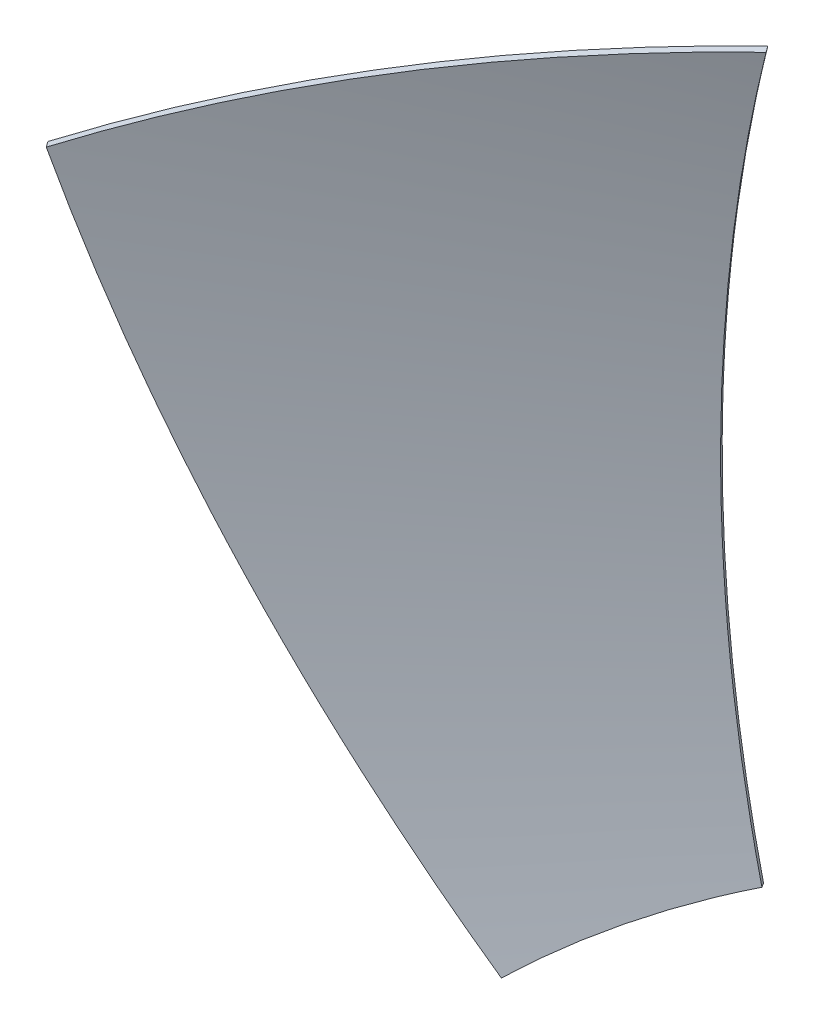
ISO-10303-21;
HEADER;
FILE_DESCRIPTION(('STEP AP214'),'2;1');
FILE_NAME('part.step','',(''),(''),'','','');
FILE_SCHEMA(('AUTOMOTIVE_DESIGN { 1 0 10303 214 1 1 1 1 }'));
ENDSEC;
DATA;
#1=APPLICATION_CONTEXT('core data for automotive mechanical design processes');
#2=APPLICATION_PROTOCOL_DEFINITION('international standard','automotive_design',2000,#1);
#3=PRODUCT_CONTEXT('',#1,'mechanical');
#4=PRODUCT('Part','Part','',(#3));
#5=PRODUCT_RELATED_PRODUCT_CATEGORY('part','',(#4));
#6=PRODUCT_DEFINITION_FORMATION('','',#4);
#7=PRODUCT_DEFINITION_CONTEXT('part definition',#1,'design');
#8=PRODUCT_DEFINITION('design','',#6,#7);
#9=PRODUCT_DEFINITION_SHAPE('','',#8);
#10=(LENGTH_UNIT() NAMED_UNIT(*) SI_UNIT(.MILLI.,.METRE.));
#11=(NAMED_UNIT(*) PLANE_ANGLE_UNIT() SI_UNIT($,.RADIAN.));
#12=(NAMED_UNIT(*) SI_UNIT($,.STERADIAN.) SOLID_ANGLE_UNIT());
#13=UNCERTAINTY_MEASURE_WITH_UNIT(LENGTH_MEASURE(1.E-05),#10,'distance_accuracy_value','');
#14=(GEOMETRIC_REPRESENTATION_CONTEXT(3) GLOBAL_UNCERTAINTY_ASSIGNED_CONTEXT((#13)) GLOBAL_UNIT_ASSIGNED_CONTEXT((#10,
#11,#12)) REPRESENTATION_CONTEXT('',''));
#15=CARTESIAN_POINT('',(0.,0.,0.));
#16=DIRECTION('',(0.,0.,1.));
#17=DIRECTION('',(1.,0.,0.));
#18=AXIS2_PLACEMENT_3D('',#15,#16,#17);
#19=CARTESIAN_POINT('',(165.867230023317,-110.043859723966,-2.70380006521002));
#20=DIRECTION('',(0.,0.,1.));
#21=DIRECTION('',(1.,0.,0.));
#22=AXIS2_PLACEMENT_3D('',#19,#20,#21);
#23=CONICAL_SURFACE('',#22,60.5897364806189,0.959931088596881);
#24=CARTESIAN_POINT('',(105.716633696539,-103.422289759919,-2.75685890943678));
#25=CARTESIAN_POINT('',(105.743501651271,-103.551387006296,-2.78545031312072));
#26=CARTESIAN_POINT('',(105.770834919118,-103.680379325531,-2.81408465061473));
#27=CARTESIAN_POINT('',(105.909830612346,-104.324848192517,-2.95747717970017));
#28=CARTESIAN_POINT('',(106.028451229861,-104.838701284113,-3.07286577250563));
#29=CARTESIAN_POINT('',(106.280340854169,-105.862523408114,-3.3048704575609));
#30=CARTESIAN_POINT('',(106.413609844876,-106.372492444783,-3.42148654846262));
#31=CARTESIAN_POINT('',(106.624366015325,-107.134198682592,-3.59725706665478));
#32=CARTESIAN_POINT('',(106.696423973306,-107.387550187204,-3.65598610471719));
#33=CARTESIAN_POINT('',(106.918018487235,-108.145983635365,-3.83260058189093));
#34=CARTESIAN_POINT('',(107.0729658705,-108.649406967771,-3.95090479887659));
#35=CARTESIAN_POINT('',(107.316082445498,-109.400834933894,-4.12913447064166));
#36=CARTESIAN_POINT('',(107.398900640504,-109.650683951422,-4.18867104560923));
#37=CARTESIAN_POINT('',(107.652708548266,-110.39838282532,-4.36767929954568));
#38=CARTESIAN_POINT('',(107.829040122655,-110.894347264222,-4.48754075801295));
#39=CARTESIAN_POINT('',(108.104106659498,-111.634122462909,-4.66806549431414));
#40=CARTESIAN_POINT('',(108.197553393411,-111.880009961774,-4.72836026083694));
#41=CARTESIAN_POINT('',(108.483197884536,-112.615577297198,-4.90963294286519));
#42=CARTESIAN_POINT('',(108.680686744574,-113.10312487349,-5.0309902786007));
#43=CARTESIAN_POINT('',(109.089547675613,-114.072121037847,-5.27461098125751));
#44=CARTESIAN_POINT('',(109.300919730649,-114.553569632925,-5.39687434713671));
#45=CARTESIAN_POINT('',(109.737288395776,-115.510053114074,-5.64217835277869));
#46=CARTESIAN_POINT('',(109.962284990807,-115.985088007234,-5.76521899168212));
#47=CARTESIAN_POINT('',(110.425673491545,-116.928400090076,-6.0119723039222));
#48=CARTESIAN_POINT('',(110.664065387767,-117.396677284543,-6.13568497678293));
#49=CARTESIAN_POINT('',(111.154028036546,-118.326129319009,-6.3836894509032));
#50=CARTESIAN_POINT('',(111.405598784825,-118.787304161313,-6.50798125197478));
#51=CARTESIAN_POINT('',(111.921719225178,-119.70219663041,-6.75706723197436));
#52=CARTESIAN_POINT('',(112.186268917882,-120.155914256839,-6.88186141092676));
#53=CARTESIAN_POINT('',(112.728154253414,-121.055522095423,-7.13188620114624));
#54=CARTESIAN_POINT('',(113.005489901542,-121.501412304333,-7.25711681259423));
#55=CARTESIAN_POINT('',(113.751574013473,-122.663469175715,-7.58703757153634));
#56=CARTESIAN_POINT('',(114.230786340213,-123.372840821594,-7.7920575760106));
#57=CARTESIAN_POINT('',(114.726419940195,-124.070519099482,-7.99752302693637));
#58=B_SPLINE_CURVE_WITH_KNOTS('',3,(#24,#25,#26,#27,#28,#29,#30,#31,#32,#33,#34,#35,#36,#37,#38,
#39,#40,#41,#42,#43,#44,#45,#46,#47,#48,#49,#50,#51,#52,#53,#54,#55,#56,#57),.UNSPECIFIED.,.F.,
.F.,(4,2,2,2,2,2,2,2,2,2,2,2,2,2,2,2,4),(0.,0.40478576272444,2.02408055534403,3.64337356974819,
4.45295990487899,6.07225177169528,6.881838081347,8.50113046195104,9.31071694379204,
10.9300110065528,12.5493032071385,14.1685936177568,15.7878828817883,17.4071716203031,
19.0264604374828,20.6457499259458,23.2857211636365),.UNSPECIFIED.);
#59=CARTESIAN_POINT('',(105.716633696539,-103.422289759919,-2.75685890943704));
#60=VERTEX_POINT('',#59);
#61=CARTESIAN_POINT('',(114.726419940195,-124.070519099482,-7.99752302693634));
#62=VERTEX_POINT('',#61);
#63=EDGE_CURVE('E24',#60,#62,#58,.T.);
#64=ORIENTED_EDGE('',*,*,#63,.T.);
#65=CARTESIAN_POINT('',(114.726419940195,-124.070519099482,-7.99752302693641));
#66=CARTESIAN_POINT('',(114.809859840238,-123.992089336002,-8.06839270908239));
#67=CARTESIAN_POINT('',(114.894100148894,-123.914744596253,-8.13954595753007));
#68=CARTESIAN_POINT('',(115.319395101379,-123.533239537377,-8.49686090490508));
#69=CARTESIAN_POINT('',(115.671997278696,-123.245434285019,-8.78704423252319));
#70=CARTESIAN_POINT('',(116.247774250692,-122.816821805928,-9.25266430868646));
#71=CARTESIAN_POINT('',(116.464208934884,-122.664423438026,-9.4259560292546));
#72=CARTESIAN_POINT('',(116.777438908212,-122.455834924716,-9.67445744911091));
#73=CARTESIAN_POINT('',(116.871571984799,-122.394648263058,-9.74885104371481));
#74=CARTESIAN_POINT('',(117.292662421684,-122.127516522735,-10.0804026850152));
#75=CARTESIAN_POINT('',(117.625895909209,-121.933581799808,-10.3394946224087));
#76=CARTESIAN_POINT('',(118.063345723149,-121.700801494358,-10.6757424971133));
#77=CARTESIAN_POINT('',(118.162225932865,-121.649583094497,-10.7514987942407));
#78=CARTESIAN_POINT('',(118.597066726051,-121.430442629737,-11.0835807574489));
#79=CARTESIAN_POINT('',(118.938014444425,-121.27443412984,-11.3411894895933));
#80=CARTESIAN_POINT('',(119.284000381158,-121.131786403527,-11.5999996128498));
#81=B_SPLINE_CURVE_WITH_KNOTS('',3,(#65,#66,#67,#68,#69,#70,#71,#72,#73,#74,#75,#76,#77,#78,#79,
#80),.UNSPECIFIED.,.F.,.F.,(4,2,2,2,2,2,2,4),(0.,0.404039967201263,2.02138933713246,
2.97026784667416,3.37430460638332,4.76665393129983,5.17069019074533,6.53488990231732),.UNSPECIFIED.);
#82=CARTESIAN_POINT('',(119.284000383294,-121.131786402647,-11.5999996144474));
#83=VERTEX_POINT('',#82);
#84=EDGE_CURVE('E119',#62,#83,#81,.T.);
#85=ORIENTED_EDGE('',*,*,#84,.T.);
#86=CARTESIAN_POINT('',(119.284000385593,-121.131786402455,-11.5999996160449));
#87=CARTESIAN_POINT('',(119.252441921759,-120.999201622701,-11.599999649466));
#88=CARTESIAN_POINT('',(119.221456171755,-120.866478063096,-11.6000047399862));
#89=CARTESIAN_POINT('',(119.06937662032,-120.202120635755,-11.6000530761268));
#90=CARTESIAN_POINT('',(118.956883841227,-119.668489509331,-11.6001649766075));
#91=CARTESIAN_POINT('',(118.750313153967,-118.597693140253,-11.6004735845139));
#92=CARTESIAN_POINT('',(118.65623522152,-118.06052790226,-11.6006702918278));
#93=CARTESIAN_POINT('',(118.486526100097,-116.983287354517,-11.6010958966162));
#94=CARTESIAN_POINT('',(118.410894890631,-116.443212048001,-11.6013247940549));
#95=CARTESIAN_POINT('',(118.278107838222,-115.360801032586,-11.6017712994766));
#96=CARTESIAN_POINT('',(118.220951978756,-114.81846532571,-11.6019889074696));
#97=CARTESIAN_POINT('',(118.125133380539,-113.732148961436,-11.6023789968142));
#98=CARTESIAN_POINT('',(118.086470629371,-113.188168305142,-11.602551478196));
#99=CARTESIAN_POINT('',(118.04235826572,-112.371517295548,-11.6027589088295));
#100=CARTESIAN_POINT('',(118.029968067831,-112.099201768262,-11.6028195019018));
#101=CARTESIAN_POINT('',(117.999733257601,-111.281919333503,-11.6029726866693));
#102=CARTESIAN_POINT('',(117.98882860657,-110.736675374005,-11.6030366646345));
#103=CARTESIAN_POINT('',(117.985529051212,-109.646149650511,-11.6030799623008));
#104=CARTESIAN_POINT('',(117.993134145066,-109.100867886518,-11.6030592820103));
#105=CARTESIAN_POINT('',(118.026849463274,-108.010858385743,-11.6029358242947));
#106=CARTESIAN_POINT('',(118.052959690095,-107.466130649034,-11.6028330468587));
#107=CARTESIAN_POINT('',(118.105989253905,-106.650010263481,-11.6026274061328));
#108=CARTESIAN_POINT('',(118.125975024499,-106.378146670604,-11.6025502856871));
#109=CARTESIAN_POINT('',(118.192868616681,-105.563045113493,-11.6022970817974));
#110=CARTESIAN_POINT('',(118.246709880512,-105.020355598429,-11.6020991678228));
#111=CARTESIAN_POINT('',(118.372853010664,-103.937143181995,-11.601673338748));
#112=CARTESIAN_POINT('',(118.445154890013,-103.396620282154,-11.6014454236266));
#113=CARTESIAN_POINT('',(118.608193615063,-102.318344223928,-11.6009981951377));
#114=CARTESIAN_POINT('',(118.698930477867,-101.780591068114,-11.6007788817781));
#115=CARTESIAN_POINT('',(118.848818054472,-100.976596732402,-11.6004924206039));
#116=CARTESIAN_POINT('',(118.901074385267,-100.709052445468,-11.6004040220372));
#117=CARTESIAN_POINT('',(119.093660762501,-99.7661865883979,-11.6001296377111));
#118=CARTESIAN_POINT('',(119.246393879688,-99.0933910179598,-11.6000013307998));
#119=CARTESIAN_POINT('',(119.413798995974,-98.4241287762925,-11.599999616045));
#120=B_SPLINE_CURVE_WITH_KNOTS('',3,(#86,#87,#88,#89,#90,#91,#92,#93,#94,#95,#96,#97,#98,#99,
#100,#101,#102,#103,#104,#105,#106,#107,#108,#109,#110,#111,#112,#113,#114,#115,#116,#117,#118,
#119),.UNSPECIFIED.,.F.,.F.,(4,2,2,2,2,2,2,2,2,2,2,2,2,2,2,2,4),(0.,0.408872020992576,
2.04458807188362,3.68030196606371,5.31601404326509,6.95172465749625,8.58743417331103,
9.40520007720244,11.0409086443229,12.6766170507053,14.3123256752552,15.1300916054466,
16.7658012640515,18.4015120768997,20.0372244071613,20.8549909331858,22.9242005441211),.UNSPECIFIED.);
#121=CARTESIAN_POINT('',(119.413798989133,-98.4241287597755,-11.5999996085915));
#122=VERTEX_POINT('',#121);
#123=EDGE_CURVE('E69',#83,#122,#120,.T.);
#124=ORIENTED_EDGE('',*,*,#123,.T.);
#125=CARTESIAN_POINT('',(119.413798982293,-98.4241287432584,-11.599999601138));
#126=CARTESIAN_POINT('',(119.301953712093,-98.4412104901223,-11.5269277924609));
#127=CARTESIAN_POINT('',(119.190140672359,-98.4587955375084,-11.4539215793916));
#128=CARTESIAN_POINT('',(118.854796467865,-98.5130887271768,-11.2350970855351));
#129=CARTESIAN_POINT('',(118.631377710815,-98.5513324085286,-11.0894843924826));
#130=CARTESIAN_POINT('',(118.296521679455,-98.6118729425073,-10.8715014666111));
#131=CARTESIAN_POINT('',(118.184940623444,-98.6325838357603,-10.7989081571441));
#132=CARTESIAN_POINT('',(117.961880941602,-98.6750740581805,-10.6538722193286));
#133=CARTESIAN_POINT('',(117.850402317709,-98.6968534071582,-10.5814295938));
#134=CARTESIAN_POINT('',(117.515596171541,-98.7639473986436,-10.3639886516834));
#135=CARTESIAN_POINT('',(117.292442123702,-98.8109199538624,-10.2192312374121));
#136=CARTESIAN_POINT('',(116.846660677148,-98.9091192121432,-9.93034069721817));
#137=CARTESIAN_POINT('',(116.624033294804,-98.9603460456937,-9.78620759058723));
#138=CARTESIAN_POINT('',(116.179323100832,-99.066670092655,-9.49848651326151));
#139=CARTESIAN_POINT('',(115.957240337166,-99.1217676351095,-9.35489859000832));
#140=CARTESIAN_POINT('',(115.513733934636,-99.2361031739473,-9.06835522192479));
#141=CARTESIAN_POINT('',(115.292310291566,-99.295341143854,-8.92539977305624));
#142=CARTESIAN_POINT('',(114.850220966289,-99.4181351356509,-8.64017967403885));
#143=CARTESIAN_POINT('',(114.629555269426,-99.481691073544,-8.49791501050989));
#144=CARTESIAN_POINT('',(114.189071615047,-99.6132070383141,-8.21411332942303));
#145=CARTESIAN_POINT('',(113.969253664518,-99.6811671014047,-8.07257631785873));
#146=CARTESIAN_POINT('',(113.311231482644,-99.8915808450916,-7.64909969090483));
#147=CARTESIAN_POINT('',(112.874393732979,-100.040586177942,-7.3682524471451));
#148=CARTESIAN_POINT('',(112.222863012958,-100.27654899942,-6.94954432554162));
#149=CARTESIAN_POINT('',(112.00656539765,-100.357174494502,-6.8105679431255));
#150=CARTESIAN_POINT('',(111.575114082711,-100.522577926533,-6.53336924899355));
#151=CARTESIAN_POINT('',(111.359960255176,-100.607355387879,-6.39514685291599));
#152=CARTESIAN_POINT('',(110.716263670444,-100.867884043286,-5.98158726289023));
#153=CARTESIAN_POINT('',(110.289495922488,-101.049827845745,-5.70736416182331));
#154=CARTESIAN_POINT('',(109.441308356537,-101.430103398861,-5.16201465251692));
#155=CARTESIAN_POINT('',(109.019888550782,-101.628435187021,-4.89088825136579));
#156=CARTESIAN_POINT('',(108.392310368699,-101.938238793397,-4.48668078663266));
#157=CARTESIAN_POINT('',(108.183886444382,-102.043552126113,-4.35236524880827));
#158=CARTESIAN_POINT('',(107.594049161245,-102.348588913422,-3.9719970393543));
#159=CARTESIAN_POINT('',(107.214523589836,-102.553244903734,-3.72694501641605));
#160=CARTESIAN_POINT('',(106.461096723,-102.976953547811,-3.23966342863683));
#161=CARTESIAN_POINT('',(106.087201398735,-103.196020322033,-2.99743691436866));
#162=CARTESIAN_POINT('',(105.716633696539,-103.422289759919,-2.75685890943729));
#163=B_SPLINE_CURVE_WITH_KNOTS('',3,(#125,#126,#127,#128,#129,#130,#131,#132,#133,#134,#135,
#136,#137,#138,#139,#140,#141,#142,#143,#144,#145,#146,#147,#148,#149,#150,#151,#152,#153,#154,
#155,#156,#157,#158,#159,#160,#161,#162),.UNSPECIFIED.,.F.,.F.,(4,2,2,2,2,2,2,2,2,2,2,2,2,2,2,2,
2,2,4),(0.,0.404064072191069,1.21225536838863,1.61640708263982,2.02056629317006,
2.83085299601385,3.64116456143141,4.45154509391676,5.26192044481243,6.07228003608094,
6.88264629153242,8.50313996968814,9.31144186575601,10.1196513873613,11.7361081023953,
13.3525685167497,14.1607186353323,15.6483300826911,17.1374215323795),.UNSPECIFIED.);
#164=EDGE_CURVE('E66',#122,#60,#163,.T.);
#165=ORIENTED_EDGE('',*,*,#164,.T.);
#166=EDGE_LOOP('',(#64,#85,#124,#165));
#167=FACE_BOUND('',#166,.T.);
#168=ADVANCED_FACE('F17',(#167),#23,.F.);
#169=CARTESIAN_POINT('',(114.614684072536,-124.101165484496,-8.16299173988275));
#170=CARTESIAN_POINT('',(114.615052837775,-124.101064341311,-8.16244563851989));
#171=CARTESIAN_POINT('',(114.615421603015,-124.100963198126,-8.16189953715703));
#172=CARTESIAN_POINT('',(114.615790368255,-124.100862054941,-8.16135343579417));
#173=CARTESIAN_POINT('',(114.652666892235,-124.090747736455,-8.10674329950824));
#174=CARTESIAN_POINT('',(114.689543416215,-124.080633417969,-8.05213316322232));
#175=CARTESIAN_POINT('',(114.726419940195,-124.070519099482,-7.99752302693639));
#176=CARTESIAN_POINT('',(112.115543824348,-120.578144085337,-7.1278973751028));
#177=CARTESIAN_POINT('',(112.115920322705,-120.578071120488,-7.12735127373994));
#178=CARTESIAN_POINT('',(112.116296821061,-120.577998155639,-7.12680517237708));
#179=CARTESIAN_POINT('',(112.116673319418,-120.57792519079,-7.12625907101422));
#180=CARTESIAN_POINT('',(112.15432315507,-120.570628705891,-7.0716489347283));
#181=CARTESIAN_POINT('',(112.191970273868,-120.563327233217,-7.01703879844236));
#182=CARTESIAN_POINT('',(112.229620109519,-120.556030748318,-6.96242866215644));
#183=CARTESIAN_POINT('',(108.437014021776,-113.834523191878,-5.31571683342248));
#184=CARTESIAN_POINT('',(108.437397913056,-113.834499437081,-5.31517073205962));
#185=CARTESIAN_POINT('',(108.437781804336,-113.834475682283,-5.31462463069676));
#186=CARTESIAN_POINT('',(108.438165695615,-113.834451927486,-5.3140785293339));
#187=CARTESIAN_POINT('',(108.476554823565,-113.832076447757,-5.25946839304796));
#188=CARTESIAN_POINT('',(108.514944847044,-113.829703115415,-5.20485825676204));
#189=CARTESIAN_POINT('',(108.553333974994,-113.827327635686,-5.1502481204761));
#190=CARTESIAN_POINT('',(106.252919143338,-106.548626570469,-3.61624611019748));
#191=CARTESIAN_POINT('',(106.253301336369,-106.548649300974,-3.61570000883462));
#192=CARTESIAN_POINT('',(106.253683529401,-106.54867203148,-3.61515390747176));
#193=CARTESIAN_POINT('',(106.254065722432,-106.548694761985,-3.6146078061089));
#194=CARTESIAN_POINT('',(106.292285025561,-106.550967812512,-3.55999766982297));
#195=CARTESIAN_POINT('',(106.330504103628,-106.553240077563,-3.50538753353703));
#196=CARTESIAN_POINT('',(106.368723406758,-106.555513128089,-3.4507773972511));
#197=CARTESIAN_POINT('',(105.601466968108,-103.409611838229,-2.92232762238329));
#198=CARTESIAN_POINT('',(105.601847056321,-103.409653679555,-2.92178152102043));
#199=CARTESIAN_POINT('',(105.602227144533,-103.40969552088,-2.92123541965757));
#200=CARTESIAN_POINT('',(105.602607232746,-103.409737362206,-2.92068931829471));
#201=CARTESIAN_POINT('',(105.64061605401,-103.413921494777,-2.86607918200878));
#202=CARTESIAN_POINT('',(105.678624875274,-103.418105627348,-2.81146904572284));
#203=CARTESIAN_POINT('',(105.716633696539,-103.422289759919,-2.75685890943691));
#204=B_SPLINE_SURFACE_WITH_KNOTS('',3,3,((#169,#170,#171,#172,#173,#174,#175),(#176,#177,#178,
#179,#180,#181,#182),(#183,#184,#185,#186,#187,#188,#189),(#190,#191,#192,#193,#194,#195,#196),
(#197,#198,#199,#200,#201,#202,#203)),.UNSPECIFIED.,.F.,.F.,.F.,(4,1,4),(4,3,4),(0.,
0.571428571428571,1.),(-0.01,0.,1.),.UNSPECIFIED.);
#205=DIRECTION('',(0.553147859699595,0.151714777289771,0.819152044288282));
#206=VECTOR('',#205,1.);
#207=CARTESIAN_POINT('',(114.671658302085,-124.085538862435,-8.078619079321));
#208=LINE('',#207,#206);
#209=CARTESIAN_POINT('',(114.618355796754,-124.100157802674,-8.15755361789314));
#210=VERTEX_POINT('',#209);
#211=EDGE_CURVE('E78',#210,#62,#208,.T.);
#212=DIRECTION('',(-0.570132318961962,0.062761988565229,-0.819152044291164));
#213=VECTOR('',#212,1.);
#214=CARTESIAN_POINT('',(105.659620464643,-103.416013561062,-2.83877411386611));
#215=LINE('',#214,#213);
#216=CARTESIAN_POINT('',(105.602607225136,-103.409737366863,-2.92068931335507));
#217=VERTEX_POINT('',#216);
#218=EDGE_CURVE('E73',#60,#217,#215,.T.);
#219=CARTESIAN_POINT('',(114.618355429195,-124.100157284808,-8.15755346593873));
#220=CARTESIAN_POINT('',(114.543156817435,-123.994207405189,-8.12646529083087));
#221=CARTESIAN_POINT('',(114.468334868309,-123.887985462202,-8.09538661428292));
#222=CARTESIAN_POINT('',(114.096089038236,-123.355493917371,-7.94003106207774));
#223=CARTESIAN_POINT('',(113.804338468621,-122.925193168733,-7.81590129206731));
#224=CARTESIAN_POINT('',(113.233130724267,-122.056424150453,-7.56799495372581));
#225=CARTESIAN_POINT('',(112.953673537148,-121.617955889035,-7.44421838503919));
#226=CARTESIAN_POINT('',(112.407210924515,-120.733210010046,-7.19705550968234));
#227=CARTESIAN_POINT('',(112.140205490746,-120.286932397652,-7.07366920275346));
#228=CARTESIAN_POINT('',(111.618839128312,-119.386955383673,-6.82735043599738));
#229=CARTESIAN_POINT('',(111.364478195636,-118.933255984443,-6.70441797602624));
#230=CARTESIAN_POINT('',(110.620432104854,-117.56115490281,-6.3362947361853));
#231=CARTESIAN_POINT('',(110.149938691096,-116.632001392247,-6.09184819320995));
#232=CARTESIAN_POINT('',(109.484112002707,-115.219347710222,-5.72735706615273));
#233=CARTESIAN_POINT('',(109.268849575515,-114.745377469086,-5.60624007702221));
#234=CARTESIAN_POINT('',(108.851784624924,-113.791312342241,-5.36480797402467));
#235=CARTESIAN_POINT('',(108.649982116885,-113.311217449542,-5.24449286107294));
#236=CARTESIAN_POINT('',(108.357595059053,-112.586792179413,-5.06473635335212));
#237=CARTESIAN_POINT('',(108.261855423015,-112.344612076347,-5.00493902077002));
#238=CARTESIAN_POINT('',(107.979785277613,-111.615929163181,-4.82589145453846));
#239=CARTESIAN_POINT('',(107.798618163309,-111.127318563249,-4.70699437511959));
#240=CARTESIAN_POINT('',(107.537298117893,-110.390596246656,-4.52939402858583));
#241=CARTESIAN_POINT('',(107.451932791355,-110.144396769595,-4.47032026197368));
#242=CARTESIAN_POINT('',(107.033668427511,-108.909880238521,-4.17546730727642));
#243=CARTESIAN_POINT('',(106.726837913152,-107.912065970431,-3.94149210811227));
#244=CARTESIAN_POINT('',(106.288570024952,-106.328412117703,-3.57668658216036));
#245=CARTESIAN_POINT('',(106.138082756672,-105.748075307518,-3.44436087921399));
#246=CARTESIAN_POINT('',(105.856071080036,-104.582483858753,-3.18130268876892));
#247=CARTESIAN_POINT('',(105.724545816393,-103.997229443245,-3.05057012965453));
#248=CARTESIAN_POINT('',(105.602607243996,-103.409737416411,-2.92068933027753));
#249=B_SPLINE_CURVE_WITH_KNOTS('',3,(#219,#220,#221,#222,#223,#224,#225,#226,#227,#228,#229,
#230,#231,#232,#233,#234,#235,#236,#237,#238,#239,#240,#241,#242,#243,#244,#245,#246,#247,#248),
.UNSPECIFIED.,.F.,.F.,(4,2,2,2,2,2,2,2,2,2,2,2,2,2,4),(0.,0.400777882843406,2.00403382925235,
3.60728816120078,5.21054143033249,6.81379419089199,10.0212083982004,11.6244630559626,
13.2277195433825,14.0292899891098,15.6325471203086,16.4341173316204,19.6415537436728,
21.4831740549989,23.3247112733512),.UNSPECIFIED.);
#250=EDGE_CURVE('E113',#210,#217,#249,.T.);
#251=ORIENTED_EDGE('',*,*,#211,.T.);
#252=ORIENTED_EDGE('',*,*,#63,.F.);
#253=ORIENTED_EDGE('',*,*,#218,.T.);
#254=ORIENTED_EDGE('',*,*,#250,.F.);
#255=EDGE_LOOP('',(#251,#252,#253,#254));
#256=FACE_BOUND('',#255,.T.);
#257=ADVANCED_FACE('F75',(#256),#204,.F.);
#258=CARTESIAN_POINT('',(105.601466968108,-103.409611838229,-2.9223276223835));
#259=CARTESIAN_POINT('',(105.601847056321,-103.409653679555,-2.92178152102064));
#260=CARTESIAN_POINT('',(105.602227144533,-103.40969552088,-2.92123541965778));
#261=CARTESIAN_POINT('',(105.602607232746,-103.409737362206,-2.92068931829492));
#262=CARTESIAN_POINT('',(105.64061605401,-103.413921494777,-2.86607918200904));
#263=CARTESIAN_POINT('',(105.678624875275,-103.418105627348,-2.81146904572317));
#264=CARTESIAN_POINT('',(105.716633696539,-103.422289759919,-2.75685890943729));
#265=CARTESIAN_POINT('',(105.717017585634,-103.422332019658,-2.7563073470608));
#266=CARTESIAN_POINT('',(105.717401474729,-103.422374279397,-2.75575578468432));
#267=CARTESIAN_POINT('',(105.717785363823,-103.422416539136,-2.75520422230783));
#268=CARTESIAN_POINT('',(108.122903128238,-101.866655618048,-4.55903629348517));
#269=CARTESIAN_POINT('',(108.123281972326,-101.866708810901,-4.55849019212231));
#270=CARTESIAN_POINT('',(108.123660816415,-101.866762003755,-4.55794409075945));
#271=CARTESIAN_POINT('',(108.124039660503,-101.866815196608,-4.55739798939659));
#272=CARTESIAN_POINT('',(108.161924069337,-101.872134481957,-4.50278785311071));
#273=CARTESIAN_POINT('',(108.199807069422,-101.877451608021,-4.44817771682482));
#274=CARTESIAN_POINT('',(108.237691478256,-101.88277089337,-4.39356758053894));
#275=CARTESIAN_POINT('',(108.238074110785,-101.882824618152,-4.39301601816245));
#276=CARTESIAN_POINT('',(108.238456743314,-101.882878342934,-4.39246445578597));
#277=CARTESIAN_POINT('',(108.238839375844,-101.882932067716,-4.39191289340948));
#278=CARTESIAN_POINT('',(111.781446457702,-100.219286023919,-6.90065159868822));
#279=CARTESIAN_POINT('',(111.781822962246,-100.219353799201,-6.90010549732536));
#280=CARTESIAN_POINT('',(111.782199466789,-100.219421574483,-6.8995593959625));
#281=CARTESIAN_POINT('',(111.782575971333,-100.219489349765,-6.89901329459964));
#282=CARTESIAN_POINT('',(111.820226425704,-100.22626687797,-6.84440315831373));
#283=CARTESIAN_POINT('',(111.857877157157,-100.233042913946,-6.78979302202785));
#284=CARTESIAN_POINT('',(111.895527611529,-100.239820442151,-6.73518288574194));
#285=CARTESIAN_POINT('',(111.895907881118,-100.239888895186,-6.73463132336545));
#286=CARTESIAN_POINT('',(111.896288150707,-100.239957348221,-6.73407976098896));
#287=CARTESIAN_POINT('',(111.896668420296,-100.240025801256,-6.73352819861248));
#288=CARTESIAN_POINT('',(115.590059914517,-99.1431456915033,-9.35519966681522));
#289=CARTESIAN_POINT('',(115.590433653486,-99.1432266321323,-9.35465356545236));
#290=CARTESIAN_POINT('',(115.590807392456,-99.1433075727613,-9.3541074640895));
#291=CARTESIAN_POINT('',(115.591181131425,-99.1433885133903,-9.35356136272664));
#292=CARTESIAN_POINT('',(115.628555028372,-99.1514825762892,-9.29895122644073));
#293=CARTESIAN_POINT('',(115.665928499936,-99.159579483413,-9.24434109015481));
#294=CARTESIAN_POINT('',(115.703302396883,-99.1676735463119,-9.1897309538689));
#295=CARTESIAN_POINT('',(115.703679873242,-99.1677552963472,-9.18917939149241));
#296=CARTESIAN_POINT('',(115.704057349601,-99.1678370463825,-9.18862782911592));
#297=CARTESIAN_POINT('',(115.704434825961,-99.1679187964178,-9.18807626673944));
#298=CARTESIAN_POINT('',(117.598525347078,-98.6862780476336,-10.6557892239095));
#299=CARTESIAN_POINT('',(117.598897589084,-98.6863655925152,-10.6552431225466));
#300=CARTESIAN_POINT('',(117.599269831089,-98.6864531373968,-10.6546970211838));
#301=CARTESIAN_POINT('',(117.599642073095,-98.6865406822784,-10.6541509198209));
#302=CARTESIAN_POINT('',(117.636866273663,-98.6952951704382,-10.599540783535));
#303=CARTESIAN_POINT('',(117.674090804794,-98.7040464486376,-10.5449306472491));
#304=CARTESIAN_POINT('',(117.711315005361,-98.7128009367974,-10.4903205109632));
#305=CARTESIAN_POINT('',(117.711690969787,-98.7128893571278,-10.4897689485867));
#306=CARTESIAN_POINT('',(117.712066934212,-98.7129777774582,-10.4892173862102));
#307=CARTESIAN_POINT('',(117.712442898638,-98.7130661977886,-10.4886658238337));
#308=CARTESIAN_POINT('',(118.614978303657,-98.5014555420685,-11.3171126533402));
#309=CARTESIAN_POINT('',(118.615349780931,-98.501546237365,-11.3165665519773));
#310=CARTESIAN_POINT('',(118.615721258206,-98.5016369326616,-11.3160204506145));
#311=CARTESIAN_POINT('',(118.61609273548,-98.5017276279581,-11.3154743492516));
#312=CARTESIAN_POINT('',(118.653240462908,-98.5107971576112,-11.2608642129657));
#313=CARTESIAN_POINT('',(118.690387508979,-98.5198716790162,-11.2062540766797));
#314=CARTESIAN_POINT('',(118.727535236407,-98.5289412086693,-11.1516439403938));
#315=CARTESIAN_POINT('',(118.727910428454,-98.5290328109188,-11.1510923780173));
#316=CARTESIAN_POINT('',(118.728285620501,-98.5291244131683,-11.1505408156408));
#317=CARTESIAN_POINT('',(118.728660812548,-98.5292160154178,-11.1499892532643));
#318=CARTESIAN_POINT('',(119.301399526752,-98.3960134616705,-11.7654683091632));
#319=CARTESIAN_POINT('',(119.301770482026,-98.3961062513825,-11.7649222078003));
#320=CARTESIAN_POINT('',(119.3021414373,-98.3961990410945,-11.7643761064375));
#321=CARTESIAN_POINT('',(119.302512392574,-98.3962918308065,-11.7638300050746));
#322=CARTESIAN_POINT('',(119.339607919969,-98.4055708020073,-11.7092198687886));
#323=CARTESIAN_POINT('',(119.376703447364,-98.4148497732081,-11.6546097325027));
#324=CARTESIAN_POINT('',(119.41379897476,-98.4241287444089,-11.5999995962168));
#325=CARTESIAN_POINT('',(119.414173639587,-98.424222462018,-11.5994480338403));
#326=CARTESIAN_POINT('',(119.414548304413,-98.4243161796272,-11.5988964714638));
#327=CARTESIAN_POINT('',(119.41492296924,-98.4244098972363,-11.5983449090873));
#328=B_SPLINE_SURFACE_WITH_KNOTS('',3,3,((#258,#259,#260,#261,#262,#263,#264,#265,#266,#267),
(#268,#269,#270,#271,#272,#273,#274,#275,#276,#277),(#278,#279,#280,#281,#282,#283,#284,#285,
#286,#287),(#288,#289,#290,#291,#292,#293,#294,#295,#296,#297),(#298,#299,#300,#301,#302,#303,
#304,#305,#306,#307),(#308,#309,#310,#311,#312,#313,#314,#315,#316,#317),(#318,#319,#320,#321,
#322,#323,#324,#325,#326,#327)),.UNSPECIFIED.,.F.,.F.,.F.,(4,1,1,1,4),(4,3,3,4),(0.,
0.571428571428571,0.785714285714286,0.857142857142857,1.),(-0.01,0.,1.,1.0101),.UNSPECIFIED.);
#329=DIRECTION('',(-0.55643291099636,0.139184567726502,-0.819152044291475));
#330=VECTOR('',#329,1.);
#331=CARTESIAN_POINT('',(119.357161564516,-98.4099616734608,-11.6833783342024));
#332=LINE('',#331,#330);
#333=CARTESIAN_POINT('',(119.302848615377,-98.3963760472405,-11.7633350556308));
#334=VERTEX_POINT('',#333);
#335=EDGE_CURVE('E84',#122,#334,#332,.T.);
#336=CARTESIAN_POINT('',(105.602607217525,-103.40973737152,-2.92068930841491));
#337=CARTESIAN_POINT('',(105.702119189096,-103.348844381804,-2.98528436370085));
#338=CARTESIAN_POINT('',(105.801874001727,-103.288471676517,-3.0499998699979));
#339=CARTESIAN_POINT('',(106.3018836599,-102.98916564891,-3.37420282142361));
#340=CARTESIAN_POINT('',(106.705679700373,-102.758006876169,-3.63545900262635));
#341=CARTESIAN_POINT('',(107.521029669696,-102.311410782977,-4.16211194410754));
#342=CARTESIAN_POINT('',(107.932601312228,-102.096016720347,-4.42751783780188));
#343=CARTESIAN_POINT('',(108.761788204572,-101.681410901425,-4.96159665284347));
#344=CARTESIAN_POINT('',(109.179403934383,-101.482200438772,-5.23026983339232));
#345=CARTESIAN_POINT('',(110.019983160904,-101.099929519612,-5.77068025801194));
#346=CARTESIAN_POINT('',(110.442946510184,-100.916868618977,-6.0424174175883));
#347=CARTESIAN_POINT('',(111.293616767944,-100.566991863173,-6.58882746136583));
#348=CARTESIAN_POINT('',(111.721323202909,-100.400174402353,-6.86350005241706));
#349=CARTESIAN_POINT('',(112.365449478837,-100.162550610193,-7.27728948302091));
#350=CARTESIAN_POINT('',(112.58029192433,-100.085539344412,-7.41532701107576));
#351=CARTESIAN_POINT('',(113.010990684036,-99.9356646387628,-7.69213602805859));
#352=CARTESIAN_POINT('',(113.226847113863,-99.8628016849585,-7.83090760092211));
#353=CARTESIAN_POINT('',(113.659490732229,-99.7213081038729,-8.10917409823901));
#354=CARTESIAN_POINT('',(113.876277955078,-99.652677634069,-8.24866904939791));
#355=CARTESIAN_POINT('',(114.310703558171,-99.5197157841432,-8.52837301349183));
#356=CARTESIAN_POINT('',(114.528341925309,-99.4553843380969,-8.66858201544155));
#357=CARTESIAN_POINT('',(114.964385888491,-99.3309669499417,-8.94968500093188));
#358=CARTESIAN_POINT('',(115.182791480053,-99.2708809830794,-9.09057898047357));
#359=CARTESIAN_POINT('',(115.620275259703,-99.1548297353364,-9.37300380500807));
#360=CARTESIAN_POINT('',(115.839353432024,-99.0988643586162,-9.51453463510727));
#361=CARTESIAN_POINT('',(116.27808918594,-98.990756176566,-9.79815658316335));
#362=CARTESIAN_POINT('',(116.497746768663,-98.938613378687,-9.94024770221178));
#363=CARTESIAN_POINT('',(116.932133645498,-98.839532397709,-10.2214736593625));
#364=CARTESIAN_POINT('',(117.146849924096,-98.792497149211,-10.3605943262905));
#365=CARTESIAN_POINT('',(117.576747377965,-98.7025382685055,-10.6394436796948));
#366=CARTESIAN_POINT('',(117.791928550372,-98.6596146110446,-10.7791723624311));
#367=CARTESIAN_POINT('',(118.222883798091,-98.5777119802655,-11.0593302748904));
#368=CARTESIAN_POINT('',(118.438658243427,-98.5387368144359,-11.1997600463255));
#369=CARTESIAN_POINT('',(118.870529583783,-98.4646701670325,-11.4811550769533));
#370=CARTESIAN_POINT('',(119.086626483831,-98.4295787466685,-11.6221203445496));
#371=CARTESIAN_POINT('',(119.302848485409,-98.3963759524023,-11.7633349512187));
#372=B_SPLINE_CURVE_WITH_KNOTS('',3,(#336,#337,#338,#339,#340,#341,#342,#343,#344,#345,#346,
#347,#348,#349,#350,#351,#352,#353,#354,#355,#356,#357,#358,#359,#360,#361,#362,#363,#364,#365,
#366,#367,#368,#369,#370,#371),.UNSPECIFIED.,.F.,.F.,(4,2,2,2,2,2,2,2,2,2,2,2,2,2,2,2,2,4),(0.,
0.400064411121029,2.00054429718613,3.60526287270653,5.21010959579424,6.81491217023928,
8.4195559498062,9.21970318172439,10.0199439758174,10.8202145264003,11.6204728021995,
12.4207264116485,13.2209614023579,14.0211979528441,14.8015700280288,15.5819373098397,
16.3630500687332,17.1441751366399),.UNSPECIFIED.);
#373=EDGE_CURVE('E81',#217,#334,#372,.T.);
#374=ORIENTED_EDGE('',*,*,#218,.F.);
#375=ORIENTED_EDGE('',*,*,#164,.F.);
#376=ORIENTED_EDGE('',*,*,#335,.T.);
#377=ORIENTED_EDGE('',*,*,#373,.F.);
#378=EDGE_LOOP('',(#374,#375,#376,#377));
#379=FACE_BOUND('',#378,.T.);
#380=ADVANCED_FACE('F79',(#379),#328,.F.);
#381=CARTESIAN_POINT('',(119.300524399856,-98.3957946119434,-11.7667566684048));
#382=CARTESIAN_POINT('',(119.301186982229,-98.39596034844,-11.7657812485558));
#383=CARTESIAN_POINT('',(119.301849564603,-98.3961260849367,-11.7648058287068));
#384=CARTESIAN_POINT('',(119.302512146977,-98.3962918214333,-11.7638304088578));
#385=CARTESIAN_POINT('',(119.339607674377,-98.405570792615,-11.7092202725719));
#386=CARTESIAN_POINT('',(119.376703201777,-98.4148497637966,-11.6546101362859));
#387=CARTESIAN_POINT('',(119.413798729177,-98.4241287349782,-11.6));
#388=CARTESIAN_POINT('',(119.414176310275,-98.424223182055,-11.5994441444387));
#389=CARTESIAN_POINT('',(119.414553891372,-98.4243176291318,-11.5988882888773));
#390=CARTESIAN_POINT('',(119.41493147247,-98.4244120762086,-11.598332433316));
#391=CARTESIAN_POINT('',(117.44155676483,-105.827585434275,-11.7667566684048));
#392=CARTESIAN_POINT('',(117.442245905621,-105.827645431102,-11.7657812485558));
#393=CARTESIAN_POINT('',(117.442935046413,-105.827705427928,-11.7648058287068));
#394=CARTESIAN_POINT('',(117.443624187204,-105.827765424754,-11.7638304088578));
#395=CARTESIAN_POINT('',(117.48220662181,-105.831124424326,-11.7092202725719));
#396=CARTESIAN_POINT('',(117.520770953542,-105.834482610506,-11.6546101362859));
#397=CARTESIAN_POINT('',(117.559353388148,-105.837841610077,-11.6));
#398=CARTESIAN_POINT('',(117.559746103902,-105.837875800041,-11.5994441444387));
#399=CARTESIAN_POINT('',(117.560138819656,-105.837909990005,-11.5988882888773));
#400=CARTESIAN_POINT('',(117.56053153541,-105.837944179969,-11.598332433316));
#401=CARTESIAN_POINT('',(117.396521652357,-113.706267325674,-11.7667566684048));
#402=CARTESIAN_POINT('',(117.397211433987,-113.706215210868,-11.7657812485558));
#403=CARTESIAN_POINT('',(117.397901215616,-113.706163096062,-11.7648058287068));
#404=CARTESIAN_POINT('',(117.398590997246,-113.706110981256,-11.7638304088578));
#405=CARTESIAN_POINT('',(117.437209310003,-113.703193266731,-11.7092202725719));
#406=CARTESIAN_POINT('',(117.47580951177,-113.700276158596,-11.6546101362859));
#407=CARTESIAN_POINT('',(117.514427824527,-113.697358444071,-11.6));
#408=CARTESIAN_POINT('',(117.514820905471,-113.697328745778,-11.5994441444387));
#409=CARTESIAN_POINT('',(117.515213986415,-113.697299047484,-11.5988882888773));
#410=CARTESIAN_POINT('',(117.515607067359,-113.697269349191,-11.598332433316));
#411=CARTESIAN_POINT('',(119.170409287419,-121.158823810073,-11.7667566684048));
#412=CARTESIAN_POINT('',(119.171073721158,-121.158665658896,-11.7657812485558));
#413=CARTESIAN_POINT('',(119.171738154897,-121.15850750772,-11.7648058287068));
#414=CARTESIAN_POINT('',(119.172402588636,-121.158349356543,-11.7638304088578));
#415=CARTESIAN_POINT('',(119.209601767108,-121.149495059265,-11.7092202725719));
#416=CARTESIAN_POINT('',(119.24680094558,-121.140640761986,-11.6546101362859));
#417=CARTESIAN_POINT('',(119.284000124052,-121.131786464708,-11.6));
#418=CARTESIAN_POINT('',(119.284378760174,-121.131696340223,-11.5994441444387));
#419=CARTESIAN_POINT('',(119.284757396296,-121.131606215739,-11.5988882888773));
#420=CARTESIAN_POINT('',(119.285136032418,-121.131516091254,-11.598332433316));
#421=B_SPLINE_SURFACE_WITH_KNOTS('',3,3,((#381,#382,#383,#384,#385,#386,#387,#388,#389,#390),
(#391,#392,#393,#394,#395,#396,#397,#398,#399,#400),(#401,#402,#403,#404,#405,#406,#407,#408,
#409,#410),(#411,#412,#413,#414,#415,#416,#417,#418,#419,#420)),.UNSPECIFIED.,.F.,.F.,.F.,(4,4),
(4,3,3,4),(0.,1.),(-0.0178615164754522,0.,1.,1.01017861516475),.UNSPECIFIED.);
#422=DIRECTION('',(-0.557987677069214,-0.132814459171096,-0.819152044295802));
#423=VECTOR('',#422,1.);
#424=CARTESIAN_POINT('',(119.228759601222,-121.144935034946,-11.6810956653056));
#425=LINE('',#424,#423);
#426=CARTESIAN_POINT('',(119.174550426739,-121.157838109507,-11.7606773996101));
#427=VERTEX_POINT('',#426);
#428=EDGE_CURVE('E45',#83,#427,#425,.T.);
#429=CARTESIAN_POINT('',(119.302848600646,-98.3963761061016,-11.7633350556399));
#430=CARTESIAN_POINT('',(119.269762448843,-98.528587932328,-11.7633558068636));
#431=CARTESIAN_POINT('',(119.237246450816,-98.6609448984309,-11.7633809560978));
#432=CARTESIAN_POINT('',(119.077502384656,-99.3235008438254,-11.7635263085441));
#433=CARTESIAN_POINT('',(118.958837887335,-99.8557928813324,-11.7637052995405));
#434=CARTESIAN_POINT('',(118.739852145673,-100.92411863026,-11.764127229021));
#435=CARTESIAN_POINT('',(118.639530877309,-101.46015233678,-11.7643701674214));
#436=CARTESIAN_POINT('',(118.457270667813,-102.5353397937,-11.7648675373795));
#437=CARTESIAN_POINT('',(118.375331706389,-103.074493540654,-11.7651219689246));
#438=CARTESIAN_POINT('',(118.229872223743,-104.155273845619,-11.7655989597043));
#439=CARTESIAN_POINT('',(118.166351686137,-104.696900401429,-11.7658215189673));
#440=CARTESIAN_POINT('',(118.057753905303,-105.782013055618,-11.7662009936048));
#441=CARTESIAN_POINT('',(118.01267664974,-106.325499152753,-11.7663579090232));
#442=CARTESIAN_POINT('',(117.958911553565,-107.141571183524,-11.7665266172838));
#443=CARTESIAN_POINT('',(117.943298789951,-107.413720912408,-11.7665717419204));
#444=CARTESIAN_POINT('',(117.903380832504,-108.230587332392,-11.7666708248366));
#445=CARTESIAN_POINT('',(117.886000827872,-108.775662695523,-11.7666884745783));
#446=CARTESIAN_POINT('',(117.869719259349,-109.86607117675,-11.7666185410429));
#447=CARTESIAN_POINT('',(117.870817693587,-110.41140429482,-11.7665309577764));
#448=CARTESIAN_POINT('',(117.891495174553,-111.501738328773,-11.7662530005985));
#449=CARTESIAN_POINT('',(117.911074223648,-112.046739244613,-11.7660626266739));
#450=CARTESIAN_POINT('',(117.954295080453,-112.863437438852,-11.7657099629022));
#451=CARTESIAN_POINT('',(117.971009473187,-113.135521671934,-11.765581233239));
#452=CARTESIAN_POINT('',(118.02808292494,-113.95136923499,-11.7651653301435));
#453=CARTESIAN_POINT('',(118.075370136483,-114.494668366907,-11.7648484640685));
#454=CARTESIAN_POINT('',(118.188399225729,-115.579326741747,-11.7641635520815));
#455=CARTESIAN_POINT('',(118.254141116262,-116.12068598332,-11.763795506134));
#456=CARTESIAN_POINT('',(118.404060878488,-117.200863284523,-11.7630465624736));
#457=CARTESIAN_POINT('',(118.488238767056,-117.739681341825,-11.7626656647489));
#458=CARTESIAN_POINT('',(118.628295220022,-118.545445885582,-11.7621205348298));
#459=CARTESIAN_POINT('',(118.677275922268,-118.81360906207,-11.7619432032722));
#460=CARTESIAN_POINT('',(118.861730646069,-119.776653686164,-11.7613338814385));
#461=CARTESIAN_POINT('',(119.010403382129,-120.46901519465,-11.7609475150578));
#462=CARTESIAN_POINT('',(119.174550106191,-121.157837009628,-11.7606773602364));
#463=B_SPLINE_CURVE_WITH_KNOTS('',3,(#429,#430,#431,#432,#433,#434,#435,#436,#437,#438,#439,
#440,#441,#442,#443,#444,#445,#446,#447,#448,#449,#450,#451,#452,#453,#454,#455,#456,#457,#458,
#459,#460,#461,#462),.UNSPECIFIED.,.F.,.F.,(4,2,2,2,2,2,2,2,2,2,2,2,2,2,2,2,4),(0.,
0.408872008627615,2.04458727575797,3.68030040075421,5.31601172008483,6.95172158432362,
8.58743035447088,9.40519616533807,11.0409039864618,12.676611642049,14.3123195073706,
15.1300853415213,16.7657942216113,18.4015042388567,20.0372157532683,20.8549821750136,
22.9788418860439),.UNSPECIFIED.);
#464=EDGE_CURVE('E36',#334,#427,#463,.T.);
#465=ORIENTED_EDGE('',*,*,#335,.F.);
#466=ORIENTED_EDGE('',*,*,#123,.F.);
#467=ORIENTED_EDGE('',*,*,#428,.T.);
#468=ORIENTED_EDGE('',*,*,#464,.F.);
#469=EDGE_LOOP('',(#465,#466,#467,#468));
#470=FACE_BOUND('',#469,.T.);
#471=ADVANCED_FACE('F138',(#470),#421,.F.);
#472=CARTESIAN_POINT('',(119.221414115015,-121.138127288773,-11.8004941054634));
#473=CARTESIAN_POINT('',(119.258614831574,-121.129279424653,-11.7458839691774));
#474=CARTESIAN_POINT('',(119.295815540162,-121.120431613276,-11.6912738328915));
#475=CARTESIAN_POINT('',(119.333016256723,-121.111583749156,-11.6366636966056));
#476=CARTESIAN_POINT('',(119.333388263888,-121.111495270515,-11.6361175952428));
#477=CARTESIAN_POINT('',(119.333760271054,-121.111406791873,-11.6355714938799));
#478=CARTESIAN_POINT('',(119.334132278219,-121.111318313232,-11.635025392517));
#479=CARTESIAN_POINT('',(119.205077025289,-121.144867957623,-11.7882727442352));
#480=CARTESIAN_POINT('',(119.242277229153,-121.136017949117,-11.7336626079492));
#481=CARTESIAN_POINT('',(119.279477427702,-121.127167975773,-11.6790524716633));
#482=CARTESIAN_POINT('',(119.316677631566,-121.118317967267,-11.6244423353774));
#483=CARTESIAN_POINT('',(119.317049633605,-121.118229467181,-11.6238962340146));
#484=CARTESIAN_POINT('',(119.317421635643,-121.118140967096,-11.6233501326517));
#485=CARTESIAN_POINT('',(119.317793637682,-121.118052467011,-11.6228040312888));
#486=CARTESIAN_POINT('',(119.188739935564,-121.151608626473,-11.776051383007));
#487=CARTESIAN_POINT('',(119.225939626731,-121.142756473581,-11.721441246721));
#488=CARTESIAN_POINT('',(119.263139315241,-121.133904338269,-11.6668311104351));
#489=CARTESIAN_POINT('',(119.30033900641,-121.125052185377,-11.6122209741492));
#490=CARTESIAN_POINT('',(119.300711003321,-121.124963663848,-11.6116748727863));
#491=CARTESIAN_POINT('',(119.301083000233,-121.124875142319,-11.6111287714235));
#492=CARTESIAN_POINT('',(119.301454997145,-121.12478662079,-11.6105826700606));
#493=CARTESIAN_POINT('',(119.172402845838,-121.158349295323,-11.7638300217788));
#494=CARTESIAN_POINT('',(119.209602024309,-121.149494998045,-11.7092198854928));
#495=CARTESIAN_POINT('',(119.246801202781,-121.140640700766,-11.6546097492069));
#496=CARTESIAN_POINT('',(119.284000381253,-121.131786403488,-11.599999612921));
#497=CARTESIAN_POINT('',(119.284372373038,-121.131697860515,-11.5994535115581));
#498=CARTESIAN_POINT('',(119.284744364822,-121.131609317542,-11.5989074101953));
#499=CARTESIAN_POINT('',(119.285116356607,-121.13152077457,-11.5983613088324));
#500=CARTESIAN_POINT('',(117.538693873263,-121.832416180323,-10.5416938989582));
#501=CARTESIAN_POINT('',(117.575841782127,-121.823347444448,-10.4870837626723));
#502=CARTESIAN_POINT('',(117.612989956738,-121.814276950439,-10.4324736263863));
#503=CARTESIAN_POINT('',(117.650137865602,-121.805208214563,-10.3778634901004));
#504=CARTESIAN_POINT('',(117.650509344691,-121.805117527204,-10.3773173887375));
#505=CARTESIAN_POINT('',(117.650880823779,-121.805026839845,-10.3767712873747));
#506=CARTESIAN_POINT('',(117.651252302868,-121.804936152487,-10.3762251860118));
#507=CARTESIAN_POINT('',(115.967228112917,-122.82824937182,-9.30963726457911));
#508=CARTESIAN_POINT('',(116.004270075615,-122.818738879805,-9.25502712829317));
#509=CARTESIAN_POINT('',(116.041312351725,-122.809227605965,-9.20041699200724));
#510=CARTESIAN_POINT('',(116.078354314423,-122.799717113949,-9.14580685572131));
#511=CARTESIAN_POINT('',(116.07872473405,-122.799622009029,-9.14526075435845));
#512=CARTESIAN_POINT('',(116.079095153677,-122.799526904109,-9.14471465299559));
#513=CARTESIAN_POINT('',(116.079465573304,-122.799431799189,-9.14416855163273));
#514=CARTESIAN_POINT('',(114.615790368255,-124.100862054941,-8.16135343579418));
#515=CARTESIAN_POINT('',(114.652666892235,-124.090747736455,-8.10674329950825));
#516=CARTESIAN_POINT('',(114.689543416215,-124.080633417969,-8.05213316322232));
#517=CARTESIAN_POINT('',(114.726419940195,-124.070519099482,-7.99752302693639));
#518=CARTESIAN_POINT('',(114.726788705435,-124.070417956297,-7.99697692557353));
#519=CARTESIAN_POINT('',(114.727157470675,-124.070316813112,-7.99643082421067));
#520=CARTESIAN_POINT('',(114.727526235914,-124.070215669927,-7.99588472284781));
#521=B_SPLINE_SURFACE_WITH_KNOTS('',3,3,((#472,#473,#474,#475,#476,#477,#478),(#479,#480,#481,
#482,#483,#484,#485),(#486,#487,#488,#489,#490,#491,#492),(#493,#494,#495,#496,#497,#498,#499),
(#500,#501,#502,#503,#504,#505,#506),(#507,#508,#509,#510,#511,#512,#513),(#514,#515,#516,#517,
#518,#519,#520)),.UNSPECIFIED.,.F.,.F.,.F.,(4,3,4),(4,3,4),(-0.01,0.,1.),(0.,1.,1.01),.UNSPECIFIED.);
#522=CARTESIAN_POINT('',(119.174550484125,-121.15783808583,-11.7606774425444));
#523=CARTESIAN_POINT('',(119.072166250588,-121.200084879072,-11.6840754557341));
#524=CARTESIAN_POINT('',(118.970192998716,-121.243522838956,-11.6075539071559));
#525=CARTESIAN_POINT('',(118.462226001183,-121.466718410207,-11.2252164294203));
#526=CARTESIAN_POINT('',(118.062731022758,-121.664169857297,-10.9208093561358));
#527=CARTESIAN_POINT('',(117.475934090797,-121.98740371859,-10.467709611427));
#528=CARTESIAN_POINT('',(117.282392178043,-122.099669332912,-10.3172478596332));
#529=CARTESIAN_POINT('',(116.899740993722,-122.333139846236,-10.0176280224251));
#530=CARTESIAN_POINT('',(116.710631647621,-122.454344594784,-9.86846991511666));
#531=CARTESIAN_POINT('',(116.189539148432,-122.804963819728,-9.45426245583122));
#532=CARTESIAN_POINT('',(115.862783527468,-123.044180189036,-9.19080597903898));
#533=CARTESIAN_POINT('',(115.385832626638,-123.424174711416,-8.79995119102021));
#534=CARTESIAN_POINT('',(115.228975558685,-123.554433996148,-8.67032809450436));
#535=CARTESIAN_POINT('',(114.920019934725,-123.822003282304,-8.41269708725519));
#536=CARTESIAN_POINT('',(114.76792141409,-123.959313336122,-8.28468918853294));
#537=CARTESIAN_POINT('',(114.618356423577,-124.10015807638,-8.15755399023425));
#538=B_SPLINE_CURVE_WITH_KNOTS('',3,(#522,#523,#524,#525,#526,#527,#528,#529,#530,#531,#532,
#533,#534,#535,#536,#537),.UNSPECIFIED.,.F.,.F.,(4,2,2,2,2,2,2,4),(0.,0.4040367535117,
2.02123421459863,2.82998140755412,3.6387149917129,5.08673532583092,5.81142609314708,
6.53612224630132),.UNSPECIFIED.);
#539=EDGE_CURVE('E11',#427,#210,#538,.T.);
#540=ORIENTED_EDGE('',*,*,#428,.F.);
#541=ORIENTED_EDGE('',*,*,#84,.F.);
#542=ORIENTED_EDGE('',*,*,#211,.F.);
#543=ORIENTED_EDGE('',*,*,#539,.F.);
#544=EDGE_LOOP('',(#540,#541,#542,#543));
#545=FACE_BOUND('',#544,.T.);
#546=ADVANCED_FACE('F19',(#545),#521,.F.);
#547=CARTESIAN_POINT('',(165.753203559524,-110.031307326254,-2.8676230510917));
#548=DIRECTION('',(0.,0.,1.));
#549=DIRECTION('',(1.,0.,0.));
#550=AXIS2_PLACEMENT_3D('',#547,#548,#549);
#551=CONICAL_SURFACE('',#550,60.5897470817274,0.959931088596881);
#552=ORIENTED_EDGE('',*,*,#464,.T.);
#553=ORIENTED_EDGE('',*,*,#539,.T.);
#554=ORIENTED_EDGE('',*,*,#250,.T.);
#555=ORIENTED_EDGE('',*,*,#373,.T.);
#556=EDGE_LOOP('',(#552,#553,#554,#555));
#557=FACE_BOUND('',#556,.T.);
#558=ADVANCED_FACE('F99',(#557),#551,.T.);
#559=CLOSED_SHELL('',(#168,#257,#380,#471,#546,#558));
#560=MANIFOLD_SOLID_BREP('B1',#559);
#561=ADVANCED_BREP_SHAPE_REPRESENTATION('',(#18,#560),#14);
#562=SHAPE_DEFINITION_REPRESENTATION(#9,#561);
ENDSEC;
END-ISO-10303-21;
